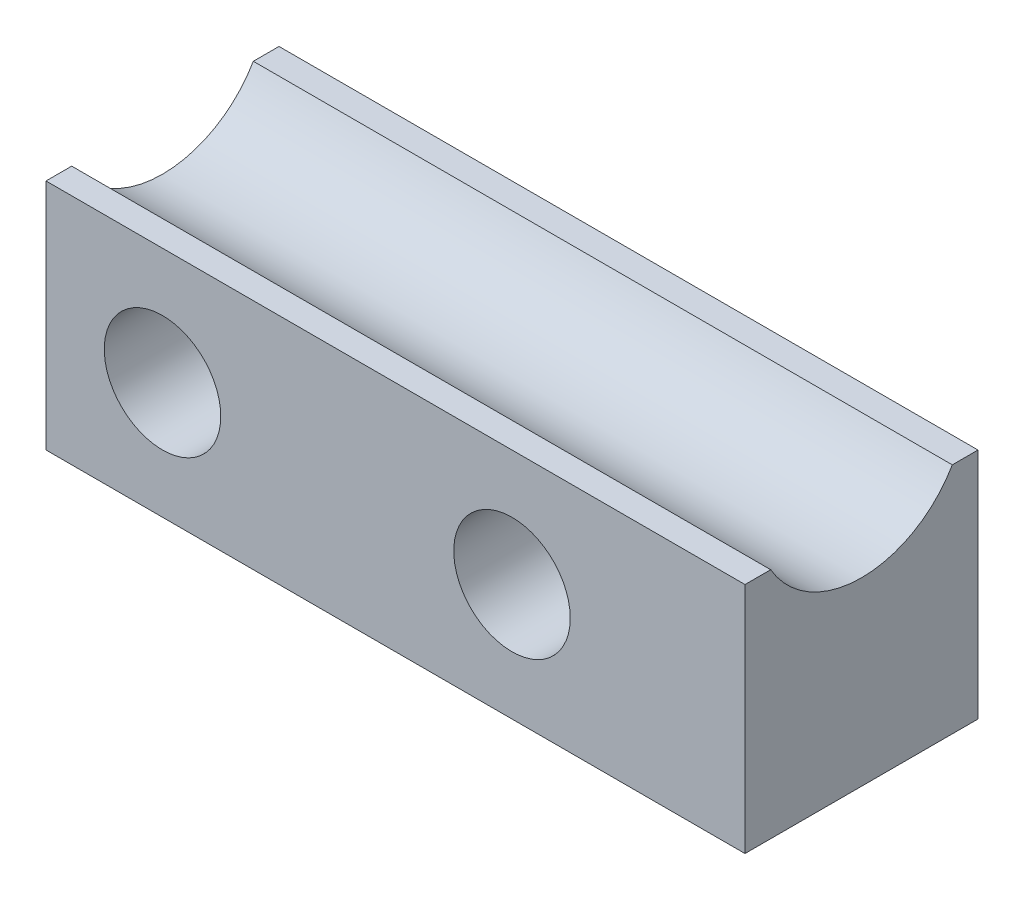
ISO-10303-21;
HEADER;
FILE_DESCRIPTION(('STEP AP214'),'2;1');
FILE_NAME('part.step','',(''),(''),'','','');
FILE_SCHEMA(('AUTOMOTIVE_DESIGN { 1 0 10303 214 1 1 1 1 }'));
ENDSEC;
DATA;
#1=APPLICATION_CONTEXT('core data for automotive mechanical design processes');
#2=APPLICATION_PROTOCOL_DEFINITION('international standard','automotive_design',2000,#1);
#3=PRODUCT_CONTEXT('',#1,'mechanical');
#4=PRODUCT('Part','Part','',(#3));
#5=PRODUCT_RELATED_PRODUCT_CATEGORY('part','',(#4));
#6=PRODUCT_DEFINITION_FORMATION('','',#4);
#7=PRODUCT_DEFINITION_CONTEXT('part definition',#1,'design');
#8=PRODUCT_DEFINITION('design','',#6,#7);
#9=PRODUCT_DEFINITION_SHAPE('','',#8);
#10=(LENGTH_UNIT() NAMED_UNIT(*) SI_UNIT(.MILLI.,.METRE.));
#11=(NAMED_UNIT(*) PLANE_ANGLE_UNIT() SI_UNIT($,.RADIAN.));
#12=(NAMED_UNIT(*) SI_UNIT($,.STERADIAN.) SOLID_ANGLE_UNIT());
#13=UNCERTAINTY_MEASURE_WITH_UNIT(LENGTH_MEASURE(1.E-05),#10,'distance_accuracy_value','');
#14=(GEOMETRIC_REPRESENTATION_CONTEXT(3) GLOBAL_UNCERTAINTY_ASSIGNED_CONTEXT((#13)) GLOBAL_UNIT_ASSIGNED_CONTEXT((#10,
#11,#12)) REPRESENTATION_CONTEXT('',''));
#15=CARTESIAN_POINT('',(0.,0.,0.));
#16=DIRECTION('',(0.,0.,1.));
#17=DIRECTION('',(1.,0.,0.));
#18=AXIS2_PLACEMENT_3D('',#15,#16,#17);
#19=CARTESIAN_POINT('',(-15.,5.,10.));
#20=DIRECTION('',(0.,-1.,0.));
#21=DIRECTION('',(0.,0.,-1.));
#22=AXIS2_PLACEMENT_3D('',#19,#20,#21);
#23=PLANE('',#22);
#24=DIRECTION('',(0.,0.,-1.));
#25=VECTOR('',#24,1.);
#26=CARTESIAN_POINT('',(-15.,5.,10.));
#27=LINE('',#26,#25);
#28=CARTESIAN_POINT('',(-15.,5.,1.10288568297003));
#29=VERTEX_POINT('',#28);
#30=CARTESIAN_POINT('',(-15.,5.,0.));
#31=VERTEX_POINT('',#30);
#32=EDGE_CURVE('E106',#29,#31,#27,.T.);
#33=ORIENTED_EDGE('',*,*,#32,.F.);
#34=DIRECTION('',(1.,0.,0.));
#35=VECTOR('',#34,1.);
#36=CARTESIAN_POINT('',(-15.001,5.,1.10288568297003));
#37=LINE('',#36,#35);
#38=CARTESIAN_POINT('',(15.,5.,1.10288568297003));
#39=VERTEX_POINT('',#38);
#40=EDGE_CURVE('E48',#39,#29,#37,.F.);
#41=ORIENTED_EDGE('',*,*,#40,.F.);
#42=DIRECTION('',(0.,0.,-1.));
#43=VECTOR('',#42,1.);
#44=CARTESIAN_POINT('',(15.,5.,10.));
#45=LINE('',#44,#43);
#46=CARTESIAN_POINT('',(15.,5.,0.));
#47=VERTEX_POINT('',#46);
#48=EDGE_CURVE('E41',#39,#47,#45,.T.);
#49=ORIENTED_EDGE('',*,*,#48,.T.);
#50=DIRECTION('',(-1.,0.,0.));
#51=VECTOR('',#50,1.);
#52=CARTESIAN_POINT('',(-15.,5.,0.));
#53=LINE('',#52,#51);
#54=EDGE_CURVE('E124',#47,#31,#53,.T.);
#55=ORIENTED_EDGE('',*,*,#54,.T.);
#56=EDGE_LOOP('',(#33,#41,#49,#55));
#57=FACE_BOUND('',#56,.T.);
#58=ADVANCED_FACE('F33',(#57),#23,.F.);
#59=CARTESIAN_POINT('',(0.,0.,10.));
#60=DIRECTION('',(0.,0.,-1.));
#61=DIRECTION('',(-1.,0.,0.));
#62=AXIS2_PLACEMENT_3D('',#59,#60,#61);
#63=PLANE('',#62);
#64=DIRECTION('',(0.,1.,0.));
#65=VECTOR('',#64,1.);
#66=CARTESIAN_POINT('',(15.,-5.,10.));
#67=LINE('',#66,#65);
#68=CARTESIAN_POINT('',(15.,-5.,10.));
#69=VERTEX_POINT('',#68);
#70=CARTESIAN_POINT('',(15.,5.,10.));
#71=VERTEX_POINT('',#70);
#72=EDGE_CURVE('E121',#69,#71,#67,.T.);
#73=ORIENTED_EDGE('',*,*,#72,.T.);
#74=DIRECTION('',(-1.,0.,0.));
#75=VECTOR('',#74,1.);
#76=CARTESIAN_POINT('',(-15.,5.,10.));
#77=LINE('',#76,#75);
#78=CARTESIAN_POINT('',(-15.,5.,10.));
#79=VERTEX_POINT('',#78);
#80=EDGE_CURVE('E85',#71,#79,#77,.T.);
#81=ORIENTED_EDGE('',*,*,#80,.T.);
#82=DIRECTION('',(0.,-1.,0.));
#83=VECTOR('',#82,1.);
#84=CARTESIAN_POINT('',(-15.,-5.,10.));
#85=LINE('',#84,#83);
#86=CARTESIAN_POINT('',(-15.,-5.,10.));
#87=VERTEX_POINT('',#86);
#88=EDGE_CURVE('E129',#79,#87,#85,.T.);
#89=ORIENTED_EDGE('',*,*,#88,.T.);
#90=DIRECTION('',(1.,0.,0.));
#91=VECTOR('',#90,1.);
#92=CARTESIAN_POINT('',(-15.,-5.,10.));
#93=LINE('',#92,#91);
#94=EDGE_CURVE('E57',#87,#69,#93,.T.);
#95=ORIENTED_EDGE('',*,*,#94,.T.);
#96=EDGE_LOOP('',(#73,#81,#89,#95));
#97=FACE_BOUND('',#96,.T.);
#98=CARTESIAN_POINT('',(-10.,0.,10.));
#99=DIRECTION('',(0.,0.,1.));
#100=DIRECTION('',(1.,0.,0.));
#101=AXIS2_PLACEMENT_3D('',#98,#99,#100);
#102=CIRCLE('',#101,2.5);
#103=CARTESIAN_POINT('',(-7.5,0.,10.));
#104=VERTEX_POINT('',#103);
#105=EDGE_CURVE('E127',#104,#104,#102,.T.);
#106=ORIENTED_EDGE('',*,*,#105,.F.);
#107=EDGE_LOOP('',(#106));
#108=FACE_BOUND('',#107,.T.);
#109=CARTESIAN_POINT('',(5.,0.,10.));
#110=DIRECTION('',(0.,0.,1.));
#111=DIRECTION('',(1.,0.,0.));
#112=AXIS2_PLACEMENT_3D('',#109,#110,#111);
#113=CIRCLE('',#112,2.5);
#114=CARTESIAN_POINT('',(7.5,0.,10.));
#115=VERTEX_POINT('',#114);
#116=EDGE_CURVE('E136',#115,#115,#113,.T.);
#117=ORIENTED_EDGE('',*,*,#116,.F.);
#118=EDGE_LOOP('',(#117));
#119=FACE_BOUND('',#118,.T.);
#120=ADVANCED_FACE('F147',(#97,#108,#119),#63,.F.);
#121=CARTESIAN_POINT('',(0.,0.,0.));
#122=DIRECTION('',(0.,0.,-1.));
#123=DIRECTION('',(-1.,0.,0.));
#124=AXIS2_PLACEMENT_3D('',#121,#122,#123);
#125=PLANE('',#124);
#126=CARTESIAN_POINT('',(-10.,0.,0.));
#127=DIRECTION('',(0.,0.,1.));
#128=DIRECTION('',(1.,0.,0.));
#129=AXIS2_PLACEMENT_3D('',#126,#127,#128);
#130=CIRCLE('',#129,2.5);
#131=CARTESIAN_POINT('',(-7.5,0.,0.));
#132=VERTEX_POINT('',#131);
#133=EDGE_CURVE('E133',#132,#132,#130,.T.);
#134=ORIENTED_EDGE('',*,*,#133,.T.);
#135=EDGE_LOOP('',(#134));
#136=FACE_BOUND('',#135,.T.);
#137=DIRECTION('',(0.,1.,0.));
#138=VECTOR('',#137,1.);
#139=CARTESIAN_POINT('',(15.,-5.,0.));
#140=LINE('',#139,#138);
#141=CARTESIAN_POINT('',(15.,-5.,0.));
#142=VERTEX_POINT('',#141);
#143=EDGE_CURVE('E110',#142,#47,#140,.T.);
#144=ORIENTED_EDGE('',*,*,#143,.F.);
#145=DIRECTION('',(1.,0.,0.));
#146=VECTOR('',#145,1.);
#147=CARTESIAN_POINT('',(-15.,-5.,0.));
#148=LINE('',#147,#146);
#149=CARTESIAN_POINT('',(-15.,-5.,0.));
#150=VERTEX_POINT('',#149);
#151=EDGE_CURVE('E78',#150,#142,#148,.T.);
#152=ORIENTED_EDGE('',*,*,#151,.F.);
#153=DIRECTION('',(0.,-1.,0.));
#154=VECTOR('',#153,1.);
#155=CARTESIAN_POINT('',(-15.,-5.,0.));
#156=LINE('',#155,#154);
#157=EDGE_CURVE('E122',#31,#150,#156,.T.);
#158=ORIENTED_EDGE('',*,*,#157,.F.);
#159=ORIENTED_EDGE('',*,*,#54,.F.);
#160=EDGE_LOOP('',(#144,#152,#158,#159));
#161=FACE_BOUND('',#160,.T.);
#162=CARTESIAN_POINT('',(5.,0.,0.));
#163=DIRECTION('',(0.,0.,1.));
#164=DIRECTION('',(1.,0.,0.));
#165=AXIS2_PLACEMENT_3D('',#162,#163,#164);
#166=CIRCLE('',#165,2.5);
#167=CARTESIAN_POINT('',(7.5,0.,0.));
#168=VERTEX_POINT('',#167);
#169=EDGE_CURVE('E139',#168,#168,#166,.T.);
#170=ORIENTED_EDGE('',*,*,#169,.T.);
#171=EDGE_LOOP('',(#170));
#172=FACE_BOUND('',#171,.T.);
#173=ADVANCED_FACE('F169',(#136,#161,#172),#125,.T.);
#174=CARTESIAN_POINT('',(15.,-5.,10.));
#175=DIRECTION('',(-1.,0.,0.));
#176=DIRECTION('',(0.,0.,1.));
#177=AXIS2_PLACEMENT_3D('',#174,#175,#176);
#178=PLANE('',#177);
#179=ORIENTED_EDGE('',*,*,#48,.F.);
#180=CARTESIAN_POINT('',(15.,7.25,5.));
#181=DIRECTION('',(1.,0.,0.));
#182=DIRECTION('',(0.,0.,-1.));
#183=AXIS2_PLACEMENT_3D('',#180,#181,#182);
#184=CIRCLE('',#183,4.5);
#185=CARTESIAN_POINT('',(15.,5.,8.89711431702997));
#186=VERTEX_POINT('',#185);
#187=EDGE_CURVE('E93',#186,#39,#184,.T.);
#188=ORIENTED_EDGE('',*,*,#187,.F.);
#189=EDGE_CURVE('E11',#71,#186,#45,.T.);
#190=ORIENTED_EDGE('',*,*,#189,.F.);
#191=ORIENTED_EDGE('',*,*,#72,.F.);
#192=DIRECTION('',(0.,0.,-1.));
#193=VECTOR('',#192,1.);
#194=CARTESIAN_POINT('',(15.,-5.,10.));
#195=LINE('',#194,#193);
#196=EDGE_CURVE('E118',#69,#142,#195,.T.);
#197=ORIENTED_EDGE('',*,*,#196,.T.);
#198=ORIENTED_EDGE('',*,*,#143,.T.);
#199=EDGE_LOOP('',(#179,#188,#190,#191,#197,#198));
#200=FACE_BOUND('',#199,.T.);
#201=ADVANCED_FACE('F35',(#200),#178,.F.);
#202=ORIENTED_EDGE('',*,*,#189,.T.);
#203=DIRECTION('',(1.,0.,0.));
#204=VECTOR('',#203,1.);
#205=CARTESIAN_POINT('',(-15.001,5.,8.89711431702997));
#206=LINE('',#205,#204);
#207=CARTESIAN_POINT('',(-15.,5.,8.89711431702997));
#208=VERTEX_POINT('',#207);
#209=EDGE_CURVE('E96',#208,#186,#206,.T.);
#210=ORIENTED_EDGE('',*,*,#209,.F.);
#211=EDGE_CURVE('E111',#79,#208,#27,.T.);
#212=ORIENTED_EDGE('',*,*,#211,.F.);
#213=ORIENTED_EDGE('',*,*,#80,.F.);
#214=EDGE_LOOP('',(#202,#210,#212,#213));
#215=FACE_BOUND('',#214,.T.);
#216=ADVANCED_FACE('F145',(#215),#23,.F.);
#217=CARTESIAN_POINT('',(-15.,-5.,10.));
#218=DIRECTION('',(1.,0.,0.));
#219=DIRECTION('',(0.,0.,-1.));
#220=AXIS2_PLACEMENT_3D('',#217,#218,#219);
#221=PLANE('',#220);
#222=ORIENTED_EDGE('',*,*,#211,.T.);
#223=CARTESIAN_POINT('',(-15.,7.25,5.));
#224=DIRECTION('',(1.,0.,0.));
#225=DIRECTION('',(0.,0.,-1.));
#226=AXIS2_PLACEMENT_3D('',#223,#224,#225);
#227=CIRCLE('',#226,4.5);
#228=EDGE_CURVE('E100',#29,#208,#227,.F.);
#229=ORIENTED_EDGE('',*,*,#228,.F.);
#230=ORIENTED_EDGE('',*,*,#32,.T.);
#231=ORIENTED_EDGE('',*,*,#157,.T.);
#232=DIRECTION('',(0.,0.,-1.));
#233=VECTOR('',#232,1.);
#234=CARTESIAN_POINT('',(-15.,-5.,10.));
#235=LINE('',#234,#233);
#236=EDGE_CURVE('E115',#87,#150,#235,.T.);
#237=ORIENTED_EDGE('',*,*,#236,.F.);
#238=ORIENTED_EDGE('',*,*,#88,.F.);
#239=EDGE_LOOP('',(#222,#229,#230,#231,#237,#238));
#240=FACE_BOUND('',#239,.T.);
#241=ADVANCED_FACE('F150',(#240),#221,.F.);
#242=CARTESIAN_POINT('',(-15.,-5.,10.));
#243=DIRECTION('',(0.,1.,0.));
#244=DIRECTION('',(0.,0.,1.));
#245=AXIS2_PLACEMENT_3D('',#242,#243,#244);
#246=PLANE('',#245);
#247=ORIENTED_EDGE('',*,*,#151,.T.);
#248=ORIENTED_EDGE('',*,*,#196,.F.);
#249=ORIENTED_EDGE('',*,*,#94,.F.);
#250=ORIENTED_EDGE('',*,*,#236,.T.);
#251=EDGE_LOOP('',(#247,#248,#249,#250));
#252=FACE_BOUND('',#251,.T.);
#253=ADVANCED_FACE('F152',(#252),#246,.F.);
#254=CARTESIAN_POINT('',(-10.,0.,10.));
#255=DIRECTION('',(0.,0.,-1.));
#256=DIRECTION('',(-1.,0.,0.));
#257=AXIS2_PLACEMENT_3D('',#254,#255,#256);
#258=CYLINDRICAL_SURFACE('',#257,2.5);
#259=ORIENTED_EDGE('',*,*,#105,.T.);
#260=EDGE_LOOP('',(#259));
#261=FACE_BOUND('',#260,.T.);
#262=ORIENTED_EDGE('',*,*,#133,.F.);
#263=EDGE_LOOP('',(#262));
#264=FACE_BOUND('',#263,.T.);
#265=ADVANCED_FACE('F154',(#261,#264),#258,.F.);
#266=CARTESIAN_POINT('',(5.,0.,10.));
#267=DIRECTION('',(0.,0.,-1.));
#268=DIRECTION('',(-1.,0.,0.));
#269=AXIS2_PLACEMENT_3D('',#266,#267,#268);
#270=CYLINDRICAL_SURFACE('',#269,2.5);
#271=ORIENTED_EDGE('',*,*,#116,.T.);
#272=EDGE_LOOP('',(#271));
#273=FACE_BOUND('',#272,.T.);
#274=ORIENTED_EDGE('',*,*,#169,.F.);
#275=EDGE_LOOP('',(#274));
#276=FACE_BOUND('',#275,.T.);
#277=ADVANCED_FACE('F160',(#273,#276),#270,.F.);
#278=CARTESIAN_POINT('',(-15.001,7.25,5.));
#279=DIRECTION('',(1.,0.,0.));
#280=DIRECTION('',(0.,0.,-1.));
#281=AXIS2_PLACEMENT_3D('',#278,#279,#280);
#282=CYLINDRICAL_SURFACE('',#281,4.5);
#283=ORIENTED_EDGE('',*,*,#40,.T.);
#284=ORIENTED_EDGE('',*,*,#228,.T.);
#285=ORIENTED_EDGE('',*,*,#209,.T.);
#286=ORIENTED_EDGE('',*,*,#187,.T.);
#287=EDGE_LOOP('',(#283,#284,#285,#286));
#288=FACE_BOUND('',#287,.T.);
#289=ADVANCED_FACE('F94',(#288),#282,.F.);
#290=CLOSED_SHELL('',(#58,#120,#173,#201,#216,#241,#253,#265,#277,#289));
#291=MANIFOLD_SOLID_BREP('B2',#290);
#292=ADVANCED_BREP_SHAPE_REPRESENTATION('',(#18,#291),#14);
#293=SHAPE_DEFINITION_REPRESENTATION(#9,#292);
ENDSEC;
END-ISO-10303-21;
